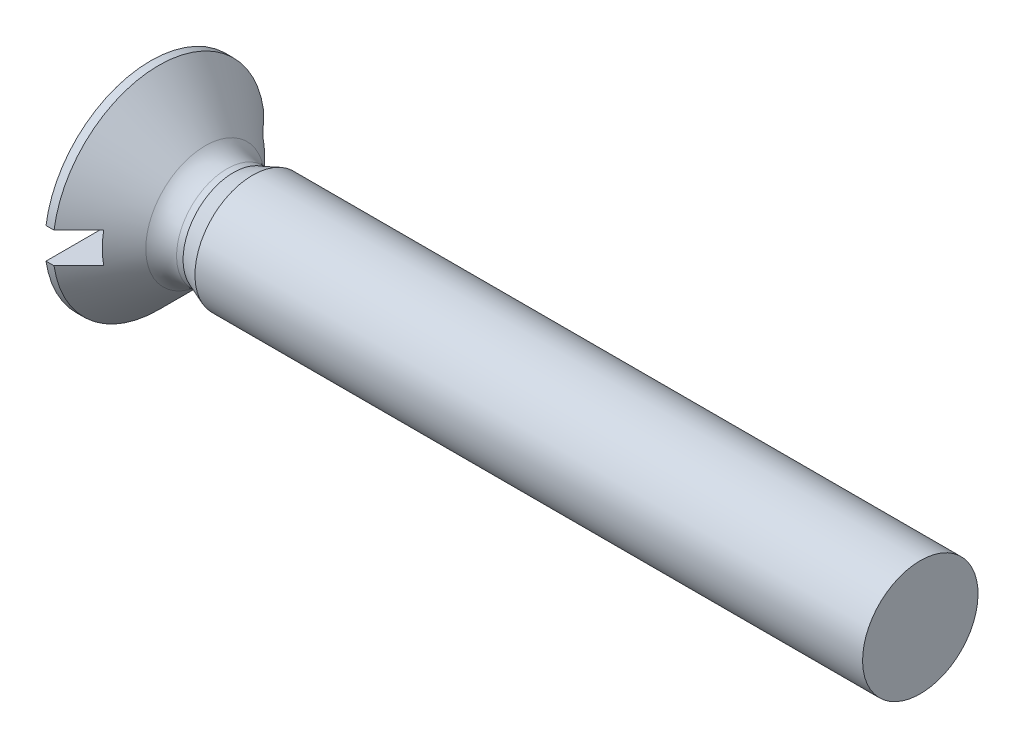
ISO-10303-21;
HEADER;
FILE_DESCRIPTION(('STEP AP214'),'2;1');
FILE_NAME('part.step','',(''),(''),'','','');
FILE_SCHEMA(('AUTOMOTIVE_DESIGN { 1 0 10303 214 1 1 1 1 }'));
ENDSEC;
DATA;
#1=APPLICATION_CONTEXT('core data for automotive mechanical design processes');
#2=APPLICATION_PROTOCOL_DEFINITION('international standard','automotive_design',2000,#1);
#3=PRODUCT_CONTEXT('',#1,'mechanical');
#4=PRODUCT('Part','Part','',(#3));
#5=PRODUCT_RELATED_PRODUCT_CATEGORY('part','',(#4));
#6=PRODUCT_DEFINITION_FORMATION('','',#4);
#7=PRODUCT_DEFINITION_CONTEXT('part definition',#1,'design');
#8=PRODUCT_DEFINITION('design','',#6,#7);
#9=PRODUCT_DEFINITION_SHAPE('','',#8);
#10=(LENGTH_UNIT() NAMED_UNIT(*) SI_UNIT(.MILLI.,.METRE.));
#11=(NAMED_UNIT(*) PLANE_ANGLE_UNIT() SI_UNIT($,.RADIAN.));
#12=(NAMED_UNIT(*) SI_UNIT($,.STERADIAN.) SOLID_ANGLE_UNIT());
#13=UNCERTAINTY_MEASURE_WITH_UNIT(LENGTH_MEASURE(1.E-05),#10,'distance_accuracy_value','');
#14=(GEOMETRIC_REPRESENTATION_CONTEXT(3) GLOBAL_UNCERTAINTY_ASSIGNED_CONTEXT((#13)) GLOBAL_UNIT_ASSIGNED_CONTEXT((#10,
#11,#12)) REPRESENTATION_CONTEXT('',''));
#15=CARTESIAN_POINT('',(0.,0.,0.));
#16=DIRECTION('',(0.,0.,1.));
#17=DIRECTION('',(1.,0.,0.));
#18=AXIS2_PLACEMENT_3D('',#15,#16,#17);
#19=CARTESIAN_POINT('',(20.,0.75,0.));
#20=DIRECTION('',(1.,0.,0.));
#21=DIRECTION('',(0.,1.,0.));
#22=AXIS2_PLACEMENT_3D('',#19,#20,#21);
#23=PLANE('',#22);
#24=CARTESIAN_POINT('',(20.,0.,0.));
#25=DIRECTION('',(1.,0.,0.));
#26=DIRECTION('',(0.,1.,0.));
#27=AXIS2_PLACEMENT_3D('',#24,#25,#26);
#28=CIRCLE('',#27,1.5);
#29=CARTESIAN_POINT('',(20.,1.5,0.));
#30=VERTEX_POINT('',#29);
#31=EDGE_CURVE('E11',#30,#30,#28,.T.);
#32=ORIENTED_EDGE('',*,*,#31,.T.);
#33=EDGE_LOOP('',(#32));
#34=FACE_BOUND('',#33,.T.);
#35=ADVANCED_FACE('F16',(#34),#23,.T.);
#36=CARTESIAN_POINT('',(11.325,0.,0.));
#37=DIRECTION('',(-1.,0.,0.));
#38=DIRECTION('',(0.,1.,0.));
#39=AXIS2_PLACEMENT_3D('',#36,#37,#38);
#40=CYLINDRICAL_SURFACE('',#39,1.5);
#41=CARTESIAN_POINT('',(2.65,0.,0.));
#42=DIRECTION('',(1.,0.,0.));
#43=DIRECTION('',(0.,1.,0.));
#44=AXIS2_PLACEMENT_3D('',#41,#42,#43);
#45=CIRCLE('',#44,1.5);
#46=CARTESIAN_POINT('',(2.65,1.5,0.));
#47=VERTEX_POINT('',#46);
#48=EDGE_CURVE('E25',#47,#47,#45,.T.);
#49=ORIENTED_EDGE('',*,*,#48,.T.);
#50=EDGE_LOOP('',(#49));
#51=FACE_BOUND('',#50,.T.);
#52=ORIENTED_EDGE('',*,*,#31,.F.);
#53=EDGE_LOOP('',(#52));
#54=FACE_BOUND('',#53,.T.);
#55=ADVANCED_FACE('F18',(#51,#54),#40,.T.);
#56=CARTESIAN_POINT('',(2.4,0.,0.));
#57=DIRECTION('',(1.,0.,0.));
#58=DIRECTION('',(0.,1.,0.));
#59=AXIS2_PLACEMENT_3D('',#56,#57,#58);
#60=CONICAL_SURFACE('',#59,1.404375,0.36532974538052);
#61=CARTESIAN_POINT('',(2.15,0.,0.));
#62=DIRECTION('',(1.,0.,0.));
#63=DIRECTION('',(0.,1.,0.));
#64=AXIS2_PLACEMENT_3D('',#61,#62,#63);
#65=CIRCLE('',#64,1.30875);
#66=CARTESIAN_POINT('',(2.15,1.30875,0.));
#67=VERTEX_POINT('',#66);
#68=EDGE_CURVE('E101',#67,#67,#65,.T.);
#69=ORIENTED_EDGE('',*,*,#68,.T.);
#70=EDGE_LOOP('',(#69));
#71=FACE_BOUND('',#70,.T.);
#72=ORIENTED_EDGE('',*,*,#48,.F.);
#73=EDGE_LOOP('',(#72));
#74=FACE_BOUND('',#73,.T.);
#75=ADVANCED_FACE('F151',(#71,#74),#60,.T.);
#76=CARTESIAN_POINT('',(2.06568542494924,0.,0.));
#77=DIRECTION('',(-1.,0.,0.));
#78=DIRECTION('',(0.,1.,0.));
#79=AXIS2_PLACEMENT_3D('',#76,#77,#78);
#80=CYLINDRICAL_SURFACE('',#79,1.30875);
#81=CARTESIAN_POINT('',(1.98137084989848,0.,0.));
#82=DIRECTION('',(1.,0.,0.));
#83=DIRECTION('',(0.,1.,0.));
#84=AXIS2_PLACEMENT_3D('',#81,#82,#83);
#85=CIRCLE('',#84,1.30875);
#86=CARTESIAN_POINT('',(1.98137084989848,1.30875,0.));
#87=VERTEX_POINT('',#86);
#88=EDGE_CURVE('E135',#87,#87,#85,.T.);
#89=ORIENTED_EDGE('',*,*,#88,.T.);
#90=EDGE_LOOP('',(#89));
#91=FACE_BOUND('',#90,.T.);
#92=ORIENTED_EDGE('',*,*,#68,.F.);
#93=EDGE_LOOP('',(#92));
#94=FACE_BOUND('',#93,.T.);
#95=ADVANCED_FACE('F155',(#91,#94),#80,.T.);
#96=CARTESIAN_POINT('',(1.98137084989848,0.,0.));
#97=DIRECTION('',(1.,0.,0.));
#98=DIRECTION('',(0.,0.,-1.));
#99=AXIS2_PLACEMENT_3D('',#96,#97,#98);
#100=TOROIDAL_SURFACE('',#99,2.10875,0.8);
#101=CARTESIAN_POINT('',(1.41568542494924,0.,0.));
#102=DIRECTION('',(1.,0.,0.));
#103=DIRECTION('',(0.,1.,0.));
#104=AXIS2_PLACEMENT_3D('',#101,#102,#103);
#105=CIRCLE('',#104,1.54306457505076);
#106=CARTESIAN_POINT('',(1.41568542494924,1.54306457505076,0.));
#107=VERTEX_POINT('',#106);
#108=EDGE_CURVE('E132',#107,#107,#105,.T.);
#109=ORIENTED_EDGE('',*,*,#108,.T.);
#110=EDGE_LOOP('',(#109));
#111=FACE_BOUND('',#110,.T.);
#112=ORIENTED_EDGE('',*,*,#88,.F.);
#113=EDGE_LOOP('',(#112));
#114=FACE_BOUND('',#113,.T.);
#115=ADVANCED_FACE('F157',(#111,#114),#100,.F.);
#116=CARTESIAN_POINT('',(0.812217712474619,0.,0.));
#117=DIRECTION('',(-1.,0.,0.));
#118=DIRECTION('',(0.,1.,0.));
#119=AXIS2_PLACEMENT_3D('',#116,#117,#118);
#120=CONICAL_SURFACE('',#119,2.14653228752538,0.785398163397448);
#121=ORIENTED_EDGE('',*,*,#108,.F.);
#122=EDGE_LOOP('',(#121));
#123=FACE_BOUND('',#122,.T.);
#124=CARTESIAN_POINT('',(0.85,-0.4,2.07046530096498));
#125=CARTESIAN_POINT('',(0.572891834114227,-0.4,2.35269743716124));
#126=CARTESIAN_POINT('',(0.20875,-0.4,2.72075357208256));
#127=(BOUNDED_CURVE() B_SPLINE_CURVE(2,(#124,#125,#126),.UNSPECIFIED.,.F.,
.F.) B_SPLINE_CURVE_WITH_KNOTS((3,3),(0.,0.913278237803101),
.UNSPECIFIED.) CURVE() GEOMETRIC_REPRESENTATION_ITEM() RATIONAL_B_SPLINE_CURVE((1.,
1.00907853467328,1.)) REPRESENTATION_ITEM(''));
#128=CARTESIAN_POINT('',(0.85,-0.4,2.07046530096498));
#129=VERTEX_POINT('',#128);
#130=CARTESIAN_POINT('',(0.20875,-0.4,2.72075357208256));
#131=VERTEX_POINT('',#130);
#132=EDGE_CURVE('E110',#129,#131,#127,.T.);
#133=ORIENTED_EDGE('',*,*,#132,.T.);
#134=CARTESIAN_POINT('',(0.20875,0.,0.));
#135=DIRECTION('',(1.,0.,0.));
#136=DIRECTION('',(0.,1.,0.));
#137=AXIS2_PLACEMENT_3D('',#134,#135,#136);
#138=CIRCLE('',#137,2.75);
#139=CARTESIAN_POINT('',(0.20875,-0.4,-2.72075357208256));
#140=VERTEX_POINT('',#139);
#141=EDGE_CURVE('E119',#131,#140,#138,.T.);
#142=ORIENTED_EDGE('',*,*,#141,.T.);
#143=CARTESIAN_POINT('',(0.20875,-0.4,-2.72075357208256));
#144=CARTESIAN_POINT('',(0.572891834114227,-0.4,-2.35269743716124));
#145=CARTESIAN_POINT('',(0.85,-0.4,-2.07046530096498));
#146=(BOUNDED_CURVE() B_SPLINE_CURVE(2,(#143,#144,#145),.UNSPECIFIED.,.F.,
.F.) B_SPLINE_CURVE_WITH_KNOTS((3,3),(0.,0.913278237803101),
.UNSPECIFIED.) CURVE() GEOMETRIC_REPRESENTATION_ITEM() RATIONAL_B_SPLINE_CURVE((1.,
1.00907853467328,1.)) REPRESENTATION_ITEM(''));
#147=CARTESIAN_POINT('',(0.85,-0.4,-2.07046530096498));
#148=VERTEX_POINT('',#147);
#149=EDGE_CURVE('E109',#140,#148,#146,.T.);
#150=ORIENTED_EDGE('',*,*,#149,.T.);
#151=CARTESIAN_POINT('',(0.85,0.,0.));
#152=DIRECTION('',(1.,0.,0.));
#153=DIRECTION('',(0.,1.,0.));
#154=AXIS2_PLACEMENT_3D('',#151,#152,#153);
#155=CIRCLE('',#154,2.10875);
#156=CARTESIAN_POINT('',(0.85,0.4,-2.07046530096498));
#157=VERTEX_POINT('',#156);
#158=EDGE_CURVE('E77',#148,#157,#155,.T.);
#159=ORIENTED_EDGE('',*,*,#158,.T.);
#160=CARTESIAN_POINT('',(0.85,0.4,-2.07046530096498));
#161=CARTESIAN_POINT('',(0.572891834114227,0.4,-2.35269743716124));
#162=CARTESIAN_POINT('',(0.20875,0.4,-2.72075357208256));
#163=(BOUNDED_CURVE() B_SPLINE_CURVE(2,(#160,#161,#162),.UNSPECIFIED.,.F.,
.F.) B_SPLINE_CURVE_WITH_KNOTS((3,3),(0.,0.913278237803101),
.UNSPECIFIED.) CURVE() GEOMETRIC_REPRESENTATION_ITEM() RATIONAL_B_SPLINE_CURVE((1.,
1.00907853467328,1.)) REPRESENTATION_ITEM(''));
#164=CARTESIAN_POINT('',(0.20875,0.4,-2.72075357208256));
#165=VERTEX_POINT('',#164);
#166=EDGE_CURVE('E72',#157,#165,#163,.T.);
#167=ORIENTED_EDGE('',*,*,#166,.T.);
#168=CARTESIAN_POINT('',(0.20875,0.,0.));
#169=DIRECTION('',(1.,0.,0.));
#170=DIRECTION('',(0.,1.,0.));
#171=AXIS2_PLACEMENT_3D('',#168,#169,#170);
#172=CIRCLE('',#171,2.75);
#173=CARTESIAN_POINT('',(0.20875,0.4,2.72075357208256));
#174=VERTEX_POINT('',#173);
#175=EDGE_CURVE('E64',#165,#174,#172,.T.);
#176=ORIENTED_EDGE('',*,*,#175,.T.);
#177=CARTESIAN_POINT('',(0.20875,0.4,2.72075357208256));
#178=CARTESIAN_POINT('',(0.572891834114227,0.4,2.35269743716124));
#179=CARTESIAN_POINT('',(0.85,0.4,2.07046530096498));
#180=(BOUNDED_CURVE() B_SPLINE_CURVE(2,(#177,#178,#179),.UNSPECIFIED.,.F.,
.F.) B_SPLINE_CURVE_WITH_KNOTS((3,3),(0.,0.913278237803101),
.UNSPECIFIED.) CURVE() GEOMETRIC_REPRESENTATION_ITEM() RATIONAL_B_SPLINE_CURVE((1.,
1.00907853467328,1.)) REPRESENTATION_ITEM(''));
#181=CARTESIAN_POINT('',(0.85,0.4,2.07046530096498));
#182=VERTEX_POINT('',#181);
#183=EDGE_CURVE('E70',#174,#182,#180,.T.);
#184=ORIENTED_EDGE('',*,*,#183,.T.);
#185=CARTESIAN_POINT('',(0.85,0.,0.));
#186=DIRECTION('',(1.,0.,0.));
#187=DIRECTION('',(0.,1.,0.));
#188=AXIS2_PLACEMENT_3D('',#185,#186,#187);
#189=CIRCLE('',#188,2.10875);
#190=EDGE_CURVE('E121',#182,#129,#189,.T.);
#191=ORIENTED_EDGE('',*,*,#190,.T.);
#192=EDGE_LOOP('',(#133,#142,#150,#159,#167,#176,#184,#191));
#193=FACE_BOUND('',#192,.T.);
#194=ADVANCED_FACE('F67',(#123,#193),#120,.T.);
#195=CARTESIAN_POINT('',(0.104375,0.,0.));
#196=DIRECTION('',(-1.,0.,0.));
#197=DIRECTION('',(0.,1.,0.));
#198=AXIS2_PLACEMENT_3D('',#195,#196,#197);
#199=CYLINDRICAL_SURFACE('',#198,2.75);
#200=DIRECTION('',(-1.,0.,0.));
#201=VECTOR('',#200,1.);
#202=CARTESIAN_POINT('',(0.104375,-0.4,2.72075357208256));
#203=LINE('',#202,#201);
#204=CARTESIAN_POINT('',(0.,-0.4,2.72075357208256));
#205=VERTEX_POINT('',#204);
#206=EDGE_CURVE('E92',#131,#205,#203,.T.);
#207=ORIENTED_EDGE('',*,*,#206,.T.);
#208=CARTESIAN_POINT('',(0.,0.,0.));
#209=DIRECTION('',(1.,0.,0.));
#210=DIRECTION('',(0.,1.,0.));
#211=AXIS2_PLACEMENT_3D('',#208,#209,#210);
#212=CIRCLE('',#211,2.75);
#213=CARTESIAN_POINT('',(0.,-0.4,-2.72075357208256));
#214=VERTEX_POINT('',#213);
#215=EDGE_CURVE('E117',#205,#214,#212,.T.);
#216=ORIENTED_EDGE('',*,*,#215,.T.);
#217=DIRECTION('',(1.,0.,0.));
#218=VECTOR('',#217,1.);
#219=CARTESIAN_POINT('',(0.104375,-0.4,-2.72075357208256));
#220=LINE('',#219,#218);
#221=EDGE_CURVE('E113',#214,#140,#220,.T.);
#222=ORIENTED_EDGE('',*,*,#221,.T.);
#223=ORIENTED_EDGE('',*,*,#141,.F.);
#224=EDGE_LOOP('',(#207,#216,#222,#223));
#225=FACE_BOUND('',#224,.T.);
#226=ADVANCED_FACE('F190',(#225),#199,.T.);
#227=CARTESIAN_POINT('',(0.,1.375,0.));
#228=DIRECTION('',(-1.,0.,0.));
#229=DIRECTION('',(0.,-1.,0.));
#230=AXIS2_PLACEMENT_3D('',#227,#228,#229);
#231=PLANE('',#230);
#232=DIRECTION('',(0.,0.,-1.));
#233=VECTOR('',#232,1.);
#234=CARTESIAN_POINT('',(0.,-0.4,0.));
#235=LINE('',#234,#233);
#236=EDGE_CURVE('E95',#205,#214,#235,.T.);
#237=ORIENTED_EDGE('',*,*,#236,.T.);
#238=ORIENTED_EDGE('',*,*,#215,.F.);
#239=EDGE_LOOP('',(#237,#238));
#240=FACE_BOUND('',#239,.T.);
#241=ADVANCED_FACE('F185',(#240),#231,.T.);
#242=CARTESIAN_POINT('',(0.,1.375,0.));
#243=DIRECTION('',(-1.,0.,0.));
#244=DIRECTION('',(0.,-1.,0.));
#245=AXIS2_PLACEMENT_3D('',#242,#243,#244);
#246=PLANE('',#245);
#247=DIRECTION('',(0.,0.,1.));
#248=VECTOR('',#247,1.);
#249=CARTESIAN_POINT('',(0.,0.4,0.));
#250=LINE('',#249,#248);
#251=CARTESIAN_POINT('',(0.,0.4,-2.72075357208256));
#252=VERTEX_POINT('',#251);
#253=CARTESIAN_POINT('',(0.,0.4,2.72075357208256));
#254=VERTEX_POINT('',#253);
#255=EDGE_CURVE('E86',#252,#254,#250,.T.);
#256=ORIENTED_EDGE('',*,*,#255,.T.);
#257=CARTESIAN_POINT('',(0.,0.,0.));
#258=DIRECTION('',(1.,0.,0.));
#259=DIRECTION('',(0.,1.,0.));
#260=AXIS2_PLACEMENT_3D('',#257,#258,#259);
#261=CIRCLE('',#260,2.75);
#262=EDGE_CURVE('E76',#252,#254,#261,.T.);
#263=ORIENTED_EDGE('',*,*,#262,.F.);
#264=EDGE_LOOP('',(#256,#263));
#265=FACE_BOUND('',#264,.T.);
#266=ADVANCED_FACE('F177',(#265),#246,.T.);
#267=CARTESIAN_POINT('',(0.104375,0.,0.));
#268=DIRECTION('',(-1.,0.,0.));
#269=DIRECTION('',(0.,1.,0.));
#270=AXIS2_PLACEMENT_3D('',#267,#268,#269);
#271=CYLINDRICAL_SURFACE('',#270,2.75);
#272=DIRECTION('',(1.,0.,0.));
#273=VECTOR('',#272,1.);
#274=CARTESIAN_POINT('',(0.104375,0.4,2.72075357208256));
#275=LINE('',#274,#273);
#276=EDGE_CURVE('E80',#254,#174,#275,.T.);
#277=ORIENTED_EDGE('',*,*,#276,.T.);
#278=ORIENTED_EDGE('',*,*,#175,.F.);
#279=DIRECTION('',(-1.,0.,0.));
#280=VECTOR('',#279,1.);
#281=CARTESIAN_POINT('',(0.104375,0.4,-2.72075357208256));
#282=LINE('',#281,#280);
#283=EDGE_CURVE('E116',#165,#252,#282,.T.);
#284=ORIENTED_EDGE('',*,*,#283,.T.);
#285=ORIENTED_EDGE('',*,*,#262,.T.);
#286=EDGE_LOOP('',(#277,#278,#284,#285));
#287=FACE_BOUND('',#286,.T.);
#288=ADVANCED_FACE('F81',(#287),#271,.T.);
#289=CARTESIAN_POINT('',(0.85,0.,0.));
#290=DIRECTION('',(-1.,0.,0.));
#291=DIRECTION('',(0.,0.,1.));
#292=AXIS2_PLACEMENT_3D('',#289,#290,#291);
#293=PLANE('',#292);
#294=ORIENTED_EDGE('',*,*,#190,.F.);
#295=DIRECTION('',(0.,0.,-1.));
#296=VECTOR('',#295,1.);
#297=CARTESIAN_POINT('',(0.85,0.4,0.));
#298=LINE('',#297,#296);
#299=EDGE_CURVE('E91',#182,#157,#298,.T.);
#300=ORIENTED_EDGE('',*,*,#299,.T.);
#301=ORIENTED_EDGE('',*,*,#158,.F.);
#302=DIRECTION('',(0.,0.,-1.));
#303=VECTOR('',#302,1.);
#304=CARTESIAN_POINT('',(0.85,-0.4,0.));
#305=LINE('',#304,#303);
#306=EDGE_CURVE('E103',#129,#148,#305,.T.);
#307=ORIENTED_EDGE('',*,*,#306,.F.);
#308=EDGE_LOOP('',(#294,#300,#301,#307));
#309=FACE_BOUND('',#308,.T.);
#310=ADVANCED_FACE('F179',(#309),#293,.T.);
#311=CARTESIAN_POINT('',(0.0125,0.4,0.));
#312=DIRECTION('',(0.,-1.,0.));
#313=DIRECTION('',(0.,0.,-1.));
#314=AXIS2_PLACEMENT_3D('',#311,#312,#313);
#315=PLANE('',#314);
#316=ORIENTED_EDGE('',*,*,#183,.F.);
#317=ORIENTED_EDGE('',*,*,#276,.F.);
#318=ORIENTED_EDGE('',*,*,#255,.F.);
#319=ORIENTED_EDGE('',*,*,#283,.F.);
#320=ORIENTED_EDGE('',*,*,#166,.F.);
#321=ORIENTED_EDGE('',*,*,#299,.F.);
#322=EDGE_LOOP('',(#316,#317,#318,#319,#320,#321));
#323=FACE_BOUND('',#322,.T.);
#324=ADVANCED_FACE('F89',(#323),#315,.T.);
#325=CARTESIAN_POINT('',(0.0125,-0.4,0.));
#326=DIRECTION('',(0.,1.,0.));
#327=DIRECTION('',(0.,0.,1.));
#328=AXIS2_PLACEMENT_3D('',#325,#326,#327);
#329=PLANE('',#328);
#330=ORIENTED_EDGE('',*,*,#132,.F.);
#331=ORIENTED_EDGE('',*,*,#306,.T.);
#332=ORIENTED_EDGE('',*,*,#149,.F.);
#333=ORIENTED_EDGE('',*,*,#221,.F.);
#334=ORIENTED_EDGE('',*,*,#236,.F.);
#335=ORIENTED_EDGE('',*,*,#206,.F.);
#336=EDGE_LOOP('',(#330,#331,#332,#333,#334,#335));
#337=FACE_BOUND('',#336,.T.);
#338=ADVANCED_FACE('F204',(#337),#329,.T.);
#339=CLOSED_SHELL('',(#35,#55,#75,#95,#115,#194,#226,#241,#266,#288,#310,#324,#338));
#340=MANIFOLD_SOLID_BREP('B1',#339);
#341=ADVANCED_BREP_SHAPE_REPRESENTATION('',(#18,#340),#14);
#342=SHAPE_DEFINITION_REPRESENTATION(#9,#341);
ENDSEC;
END-ISO-10303-21;
